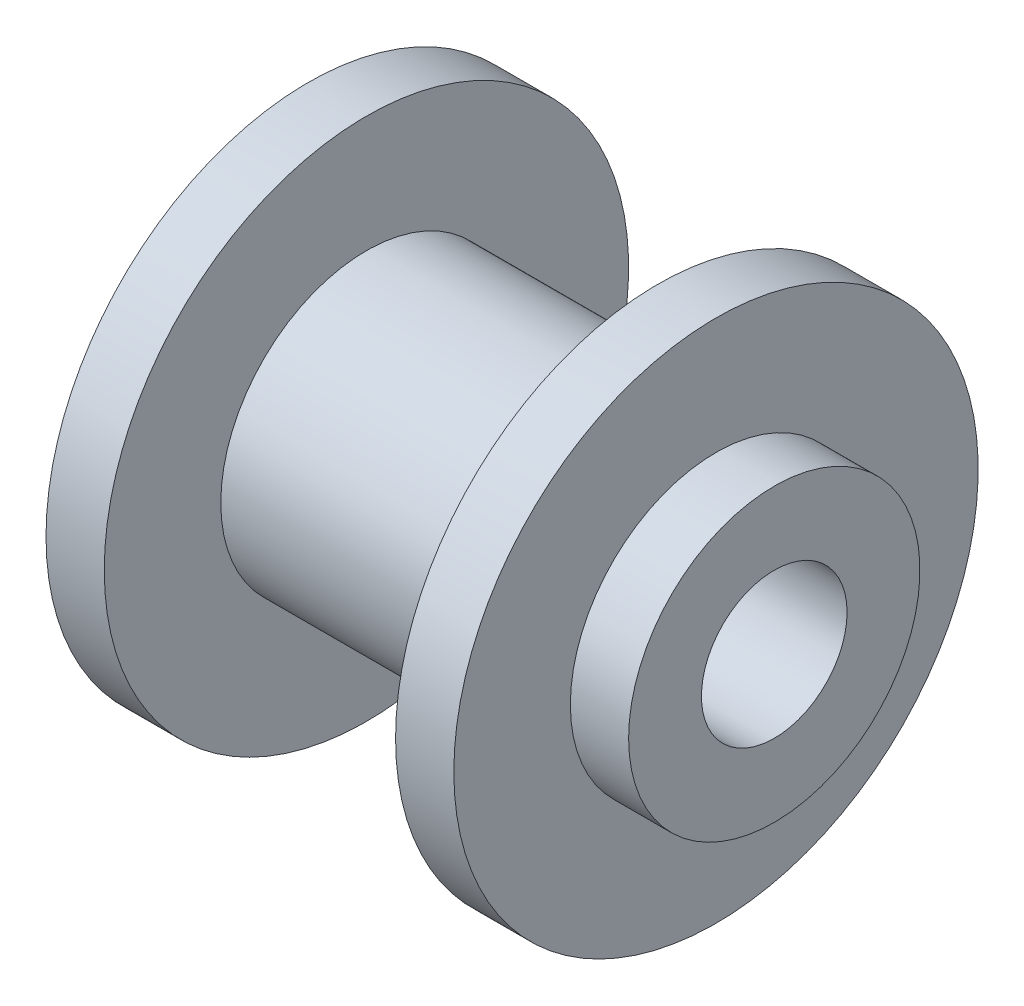
ISO-10303-21;
HEADER;
FILE_DESCRIPTION(('STEP AP214'),'2;1');
FILE_NAME('part.step','',(''),(''),'','','');
FILE_SCHEMA(('AUTOMOTIVE_DESIGN { 1 0 10303 214 1 1 1 1 }'));
ENDSEC;
DATA;
#1=APPLICATION_CONTEXT('core data for automotive mechanical design processes');
#2=APPLICATION_PROTOCOL_DEFINITION('international standard','automotive_design',2000,#1);
#3=PRODUCT_CONTEXT('',#1,'mechanical');
#4=PRODUCT('Part','Part','',(#3));
#5=PRODUCT_RELATED_PRODUCT_CATEGORY('part','',(#4));
#6=PRODUCT_DEFINITION_FORMATION('','',#4);
#7=PRODUCT_DEFINITION_CONTEXT('part definition',#1,'design');
#8=PRODUCT_DEFINITION('design','',#6,#7);
#9=PRODUCT_DEFINITION_SHAPE('','',#8);
#10=(LENGTH_UNIT() NAMED_UNIT(*) SI_UNIT(.MILLI.,.METRE.));
#11=(NAMED_UNIT(*) PLANE_ANGLE_UNIT() SI_UNIT($,.RADIAN.));
#12=(NAMED_UNIT(*) SI_UNIT($,.STERADIAN.) SOLID_ANGLE_UNIT());
#13=UNCERTAINTY_MEASURE_WITH_UNIT(LENGTH_MEASURE(1.E-05),#10,'distance_accuracy_value','');
#14=(GEOMETRIC_REPRESENTATION_CONTEXT(3) GLOBAL_UNCERTAINTY_ASSIGNED_CONTEXT((#13)) GLOBAL_UNIT_ASSIGNED_CONTEXT((#10,
#11,#12)) REPRESENTATION_CONTEXT('',''));
#15=CARTESIAN_POINT('',(0.,0.,0.));
#16=DIRECTION('',(0.,0.,1.));
#17=DIRECTION('',(1.,0.,0.));
#18=AXIS2_PLACEMENT_3D('',#15,#16,#17);
#19=CARTESIAN_POINT('',(0.,0.,0.));
#20=DIRECTION('',(1.,0.,0.));
#21=DIRECTION('',(0.,0.,-1.));
#22=AXIS2_PLACEMENT_3D('',#19,#20,#21);
#23=PLANE('',#22);
#24=CARTESIAN_POINT('',(0.,0.,0.));
#25=DIRECTION('',(1.,0.,0.));
#26=DIRECTION('',(0.,0.,-1.));
#27=AXIS2_PLACEMENT_3D('',#24,#25,#26);
#28=CIRCLE('',#27,2.5);
#29=CARTESIAN_POINT('',(0.,0.,-2.5));
#30=VERTEX_POINT('',#29);
#31=EDGE_CURVE('E84',#30,#30,#28,.T.);
#32=ORIENTED_EDGE('',*,*,#31,.T.);
#33=EDGE_LOOP('',(#32));
#34=FACE_BOUND('',#33,.T.);
#35=CARTESIAN_POINT('',(0.,0.,0.));
#36=DIRECTION('',(-1.,0.,0.));
#37=DIRECTION('',(0.,0.,1.));
#38=AXIS2_PLACEMENT_3D('',#35,#36,#37);
#39=CIRCLE('',#38,5.);
#40=CARTESIAN_POINT('',(0.,0.,5.));
#41=VERTEX_POINT('',#40);
#42=EDGE_CURVE('E10',#41,#41,#39,.T.);
#43=ORIENTED_EDGE('',*,*,#42,.T.);
#44=EDGE_LOOP('',(#43));
#45=FACE_BOUND('',#44,.T.);
#46=ADVANCED_FACE('F37',(#34,#45),#23,.F.);
#47=CARTESIAN_POINT('',(0.,0.,0.));
#48=DIRECTION('',(-1.,0.,0.));
#49=DIRECTION('',(0.,0.,1.));
#50=AXIS2_PLACEMENT_3D('',#47,#48,#49);
#51=CYLINDRICAL_SURFACE('',#50,5.);
#52=ORIENTED_EDGE('',*,*,#42,.F.);
#53=EDGE_LOOP('',(#52));
#54=FACE_BOUND('',#53,.T.);
#55=CARTESIAN_POINT('',(2.,0.,0.));
#56=DIRECTION('',(-1.,0.,0.));
#57=DIRECTION('',(0.,0.,1.));
#58=AXIS2_PLACEMENT_3D('',#55,#56,#57);
#59=CIRCLE('',#58,5.);
#60=CARTESIAN_POINT('',(2.,0.,5.));
#61=VERTEX_POINT('',#60);
#62=EDGE_CURVE('E44',#61,#61,#59,.T.);
#63=ORIENTED_EDGE('',*,*,#62,.T.);
#64=EDGE_LOOP('',(#63));
#65=FACE_BOUND('',#64,.T.);
#66=ADVANCED_FACE('F119',(#54,#65),#51,.T.);
#67=CARTESIAN_POINT('',(2.,5.,0.));
#68=DIRECTION('',(1.,0.,0.));
#69=DIRECTION('',(0.,0.,-1.));
#70=AXIS2_PLACEMENT_3D('',#67,#68,#69);
#71=PLANE('',#70);
#72=ORIENTED_EDGE('',*,*,#62,.F.);
#73=EDGE_LOOP('',(#72));
#74=FACE_BOUND('',#73,.T.);
#75=CARTESIAN_POINT('',(2.,0.,0.));
#76=DIRECTION('',(-1.,0.,0.));
#77=DIRECTION('',(0.,0.,1.));
#78=AXIS2_PLACEMENT_3D('',#75,#76,#77);
#79=CIRCLE('',#78,9.);
#80=CARTESIAN_POINT('',(2.,0.,9.));
#81=VERTEX_POINT('',#80);
#82=EDGE_CURVE('E49',#81,#81,#79,.T.);
#83=ORIENTED_EDGE('',*,*,#82,.T.);
#84=EDGE_LOOP('',(#83));
#85=FACE_BOUND('',#84,.T.);
#86=ADVANCED_FACE('F123',(#74,#85),#71,.F.);
#87=CARTESIAN_POINT('',(0.,0.,0.));
#88=DIRECTION('',(-1.,0.,0.));
#89=DIRECTION('',(0.,0.,1.));
#90=AXIS2_PLACEMENT_3D('',#87,#88,#89);
#91=CYLINDRICAL_SURFACE('',#90,9.);
#92=ORIENTED_EDGE('',*,*,#82,.F.);
#93=EDGE_LOOP('',(#92));
#94=FACE_BOUND('',#93,.T.);
#95=CARTESIAN_POINT('',(4.,0.,0.));
#96=DIRECTION('',(-1.,0.,0.));
#97=DIRECTION('',(0.,0.,1.));
#98=AXIS2_PLACEMENT_3D('',#95,#96,#97);
#99=CIRCLE('',#98,9.);
#100=CARTESIAN_POINT('',(4.,0.,9.));
#101=VERTEX_POINT('',#100);
#102=EDGE_CURVE('E54',#101,#101,#99,.T.);
#103=ORIENTED_EDGE('',*,*,#102,.T.);
#104=EDGE_LOOP('',(#103));
#105=FACE_BOUND('',#104,.T.);
#106=ADVANCED_FACE('F128',(#94,#105),#91,.T.);
#107=CARTESIAN_POINT('',(4.,9.,0.));
#108=DIRECTION('',(-1.,0.,0.));
#109=DIRECTION('',(0.,0.,1.));
#110=AXIS2_PLACEMENT_3D('',#107,#108,#109);
#111=PLANE('',#110);
#112=ORIENTED_EDGE('',*,*,#102,.F.);
#113=EDGE_LOOP('',(#112));
#114=FACE_BOUND('',#113,.T.);
#115=CARTESIAN_POINT('',(4.,0.,0.));
#116=DIRECTION('',(-1.,0.,0.));
#117=DIRECTION('',(0.,0.,1.));
#118=AXIS2_PLACEMENT_3D('',#115,#116,#117);
#119=CIRCLE('',#118,5.);
#120=CARTESIAN_POINT('',(4.,0.,5.));
#121=VERTEX_POINT('',#120);
#122=EDGE_CURVE('E60',#121,#121,#119,.T.);
#123=ORIENTED_EDGE('',*,*,#122,.T.);
#124=EDGE_LOOP('',(#123));
#125=FACE_BOUND('',#124,.T.);
#126=ADVANCED_FACE('F134',(#114,#125),#111,.F.);
#127=CARTESIAN_POINT('',(0.,0.,0.));
#128=DIRECTION('',(-1.,0.,0.));
#129=DIRECTION('',(0.,0.,1.));
#130=AXIS2_PLACEMENT_3D('',#127,#128,#129);
#131=CYLINDRICAL_SURFACE('',#130,5.);
#132=ORIENTED_EDGE('',*,*,#122,.F.);
#133=EDGE_LOOP('',(#132));
#134=FACE_BOUND('',#133,.T.);
#135=CARTESIAN_POINT('',(14.,0.,0.));
#136=DIRECTION('',(-1.,0.,0.));
#137=DIRECTION('',(0.,0.,1.));
#138=AXIS2_PLACEMENT_3D('',#135,#136,#137);
#139=CIRCLE('',#138,5.);
#140=CARTESIAN_POINT('',(14.,0.,5.));
#141=VERTEX_POINT('',#140);
#142=EDGE_CURVE('E64',#141,#141,#139,.T.);
#143=ORIENTED_EDGE('',*,*,#142,.T.);
#144=EDGE_LOOP('',(#143));
#145=FACE_BOUND('',#144,.T.);
#146=ADVANCED_FACE('F138',(#134,#145),#131,.T.);
#147=CARTESIAN_POINT('',(14.,5.,0.));
#148=DIRECTION('',(1.,0.,0.));
#149=DIRECTION('',(0.,0.,-1.));
#150=AXIS2_PLACEMENT_3D('',#147,#148,#149);
#151=PLANE('',#150);
#152=ORIENTED_EDGE('',*,*,#142,.F.);
#153=EDGE_LOOP('',(#152));
#154=FACE_BOUND('',#153,.T.);
#155=CARTESIAN_POINT('',(14.,0.,0.));
#156=DIRECTION('',(-1.,0.,0.));
#157=DIRECTION('',(0.,0.,1.));
#158=AXIS2_PLACEMENT_3D('',#155,#156,#157);
#159=CIRCLE('',#158,9.);
#160=CARTESIAN_POINT('',(14.,0.,9.));
#161=VERTEX_POINT('',#160);
#162=EDGE_CURVE('E68',#161,#161,#159,.T.);
#163=ORIENTED_EDGE('',*,*,#162,.T.);
#164=EDGE_LOOP('',(#163));
#165=FACE_BOUND('',#164,.T.);
#166=ADVANCED_FACE('F142',(#154,#165),#151,.F.);
#167=CARTESIAN_POINT('',(0.,0.,0.));
#168=DIRECTION('',(-1.,0.,0.));
#169=DIRECTION('',(0.,0.,1.));
#170=AXIS2_PLACEMENT_3D('',#167,#168,#169);
#171=CYLINDRICAL_SURFACE('',#170,9.);
#172=ORIENTED_EDGE('',*,*,#162,.F.);
#173=EDGE_LOOP('',(#172));
#174=FACE_BOUND('',#173,.T.);
#175=CARTESIAN_POINT('',(16.,0.,0.));
#176=DIRECTION('',(-1.,0.,0.));
#177=DIRECTION('',(0.,0.,1.));
#178=AXIS2_PLACEMENT_3D('',#175,#176,#177);
#179=CIRCLE('',#178,9.);
#180=CARTESIAN_POINT('',(16.,0.,9.));
#181=VERTEX_POINT('',#180);
#182=EDGE_CURVE('E72',#181,#181,#179,.T.);
#183=ORIENTED_EDGE('',*,*,#182,.T.);
#184=EDGE_LOOP('',(#183));
#185=FACE_BOUND('',#184,.T.);
#186=ADVANCED_FACE('F114',(#174,#185),#171,.T.);
#187=CARTESIAN_POINT('',(16.,9.,0.));
#188=DIRECTION('',(-1.,0.,0.));
#189=DIRECTION('',(0.,0.,1.));
#190=AXIS2_PLACEMENT_3D('',#187,#188,#189);
#191=PLANE('',#190);
#192=ORIENTED_EDGE('',*,*,#182,.F.);
#193=EDGE_LOOP('',(#192));
#194=FACE_BOUND('',#193,.T.);
#195=CARTESIAN_POINT('',(16.,0.,0.));
#196=DIRECTION('',(-1.,0.,0.));
#197=DIRECTION('',(0.,0.,1.));
#198=AXIS2_PLACEMENT_3D('',#195,#196,#197);
#199=CIRCLE('',#198,5.);
#200=CARTESIAN_POINT('',(16.,0.,5.));
#201=VERTEX_POINT('',#200);
#202=EDGE_CURVE('E76',#201,#201,#199,.T.);
#203=ORIENTED_EDGE('',*,*,#202,.T.);
#204=EDGE_LOOP('',(#203));
#205=FACE_BOUND('',#204,.T.);
#206=ADVANCED_FACE('F108',(#194,#205),#191,.F.);
#207=CARTESIAN_POINT('',(0.,0.,0.));
#208=DIRECTION('',(-1.,0.,0.));
#209=DIRECTION('',(0.,0.,1.));
#210=AXIS2_PLACEMENT_3D('',#207,#208,#209);
#211=CYLINDRICAL_SURFACE('',#210,5.);
#212=ORIENTED_EDGE('',*,*,#202,.F.);
#213=EDGE_LOOP('',(#212));
#214=FACE_BOUND('',#213,.T.);
#215=CARTESIAN_POINT('',(18.,0.,0.));
#216=DIRECTION('',(-1.,0.,0.));
#217=DIRECTION('',(0.,0.,1.));
#218=AXIS2_PLACEMENT_3D('',#215,#216,#217);
#219=CIRCLE('',#218,5.);
#220=CARTESIAN_POINT('',(18.,0.,5.));
#221=VERTEX_POINT('',#220);
#222=EDGE_CURVE('E80',#221,#221,#219,.T.);
#223=ORIENTED_EDGE('',*,*,#222,.T.);
#224=EDGE_LOOP('',(#223));
#225=FACE_BOUND('',#224,.T.);
#226=ADVANCED_FACE('F103',(#214,#225),#211,.T.);
#227=CARTESIAN_POINT('',(18.,5.,0.));
#228=DIRECTION('',(-1.,0.,0.));
#229=DIRECTION('',(0.,0.,1.));
#230=AXIS2_PLACEMENT_3D('',#227,#228,#229);
#231=PLANE('',#230);
#232=CARTESIAN_POINT('',(18.,0.,0.));
#233=DIRECTION('',(1.,0.,0.));
#234=DIRECTION('',(0.,0.,-1.));
#235=AXIS2_PLACEMENT_3D('',#232,#233,#234);
#236=CIRCLE('',#235,2.5);
#237=CARTESIAN_POINT('',(18.,0.,-2.5));
#238=VERTEX_POINT('',#237);
#239=EDGE_CURVE('E85',#238,#238,#236,.T.);
#240=ORIENTED_EDGE('',*,*,#239,.F.);
#241=EDGE_LOOP('',(#240));
#242=FACE_BOUND('',#241,.T.);
#243=ORIENTED_EDGE('',*,*,#222,.F.);
#244=EDGE_LOOP('',(#243));
#245=FACE_BOUND('',#244,.T.);
#246=ADVANCED_FACE('F97',(#242,#245),#231,.F.);
#247=CARTESIAN_POINT('',(0.,0.,0.));
#248=DIRECTION('',(1.,0.,0.));
#249=DIRECTION('',(0.,0.,-1.));
#250=AXIS2_PLACEMENT_3D('',#247,#248,#249);
#251=CYLINDRICAL_SURFACE('',#250,2.5);
#252=ORIENTED_EDGE('',*,*,#31,.F.);
#253=EDGE_LOOP('',(#252));
#254=FACE_BOUND('',#253,.T.);
#255=ORIENTED_EDGE('',*,*,#239,.T.);
#256=EDGE_LOOP('',(#255));
#257=FACE_BOUND('',#256,.T.);
#258=ADVANCED_FACE('F94',(#254,#257),#251,.F.);
#259=CLOSED_SHELL('',(#46,#66,#86,#106,#126,#146,#166,#186,#206,#226,#246,#258));
#260=MANIFOLD_SOLID_BREP('B2',#259);
#261=ADVANCED_BREP_SHAPE_REPRESENTATION('',(#18,#260),#14);
#262=SHAPE_DEFINITION_REPRESENTATION(#9,#261);
ENDSEC;
END-ISO-10303-21;
